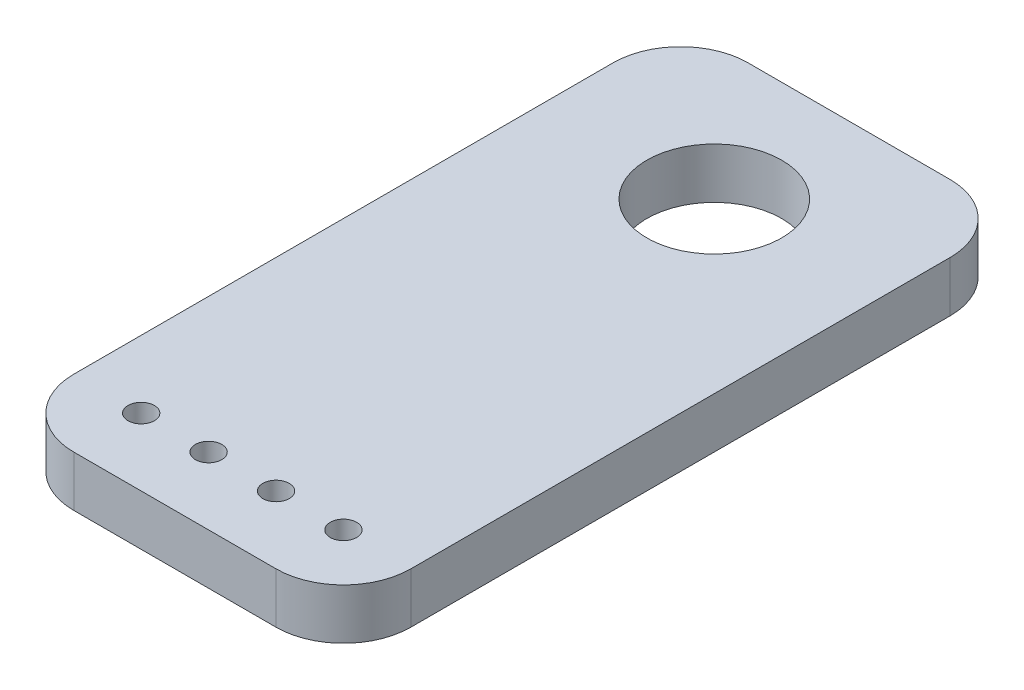
ISO-10303-21;
HEADER;
FILE_DESCRIPTION(('STEP AP214'),'2;1');
FILE_NAME('part.step','',(''),(''),'','','');
FILE_SCHEMA(('AUTOMOTIVE_DESIGN { 1 0 10303 214 1 1 1 1 }'));
ENDSEC;
DATA;
#1=APPLICATION_CONTEXT('core data for automotive mechanical design processes');
#2=APPLICATION_PROTOCOL_DEFINITION('international standard','automotive_design',2000,#1);
#3=PRODUCT_CONTEXT('',#1,'mechanical');
#4=PRODUCT('Part','Part','',(#3));
#5=PRODUCT_RELATED_PRODUCT_CATEGORY('part','',(#4));
#6=PRODUCT_DEFINITION_FORMATION('','',#4);
#7=PRODUCT_DEFINITION_CONTEXT('part definition',#1,'design');
#8=PRODUCT_DEFINITION('design','',#6,#7);
#9=PRODUCT_DEFINITION_SHAPE('','',#8);
#10=(LENGTH_UNIT() NAMED_UNIT(*) SI_UNIT(.MILLI.,.METRE.));
#11=(NAMED_UNIT(*) PLANE_ANGLE_UNIT() SI_UNIT($,.RADIAN.));
#12=(NAMED_UNIT(*) SI_UNIT($,.STERADIAN.) SOLID_ANGLE_UNIT());
#13=UNCERTAINTY_MEASURE_WITH_UNIT(LENGTH_MEASURE(1.E-05),#10,'distance_accuracy_value','');
#14=(GEOMETRIC_REPRESENTATION_CONTEXT(3) GLOBAL_UNCERTAINTY_ASSIGNED_CONTEXT((#13)) GLOBAL_UNIT_ASSIGNED_CONTEXT((#10,
#11,#12)) REPRESENTATION_CONTEXT('',''));
#15=CARTESIAN_POINT('',(0.,0.,0.));
#16=DIRECTION('',(0.,0.,1.));
#17=DIRECTION('',(1.,0.,0.));
#18=AXIS2_PLACEMENT_3D('',#15,#16,#17);
#19=CARTESIAN_POINT('',(0.,9.525,0.));
#20=DIRECTION('',(0.,1.,0.));
#21=DIRECTION('',(0.,0.,1.));
#22=AXIS2_PLACEMENT_3D('',#19,#20,#21);
#23=PLANE('',#22);
#24=CARTESIAN_POINT('',(38.1,9.525,114.3));
#25=DIRECTION('',(0.,1.,0.));
#26=DIRECTION('',(0.,0.,1.));
#27=AXIS2_PLACEMENT_3D('',#24,#25,#26);
#28=CIRCLE('',#27,2.4892);
#29=CARTESIAN_POINT('',(38.1,9.525,111.8108));
#30=VERTEX_POINT('',#29);
#31=EDGE_CURVE('E229',#30,#30,#28,.T.);
#32=ORIENTED_EDGE('',*,*,#31,.F.);
#33=EDGE_LOOP('',(#32));
#34=FACE_BOUND('',#33,.T.);
#35=CARTESIAN_POINT('',(12.7,9.525,114.3));
#36=DIRECTION('',(0.,1.,0.));
#37=DIRECTION('',(0.,0.,1.));
#38=AXIS2_PLACEMENT_3D('',#35,#36,#37);
#39=CIRCLE('',#38,2.48919999999999);
#40=CARTESIAN_POINT('',(12.7,9.525,111.8108));
#41=VERTEX_POINT('',#40);
#42=EDGE_CURVE('E244',#41,#41,#39,.T.);
#43=ORIENTED_EDGE('',*,*,#42,.F.);
#44=EDGE_LOOP('',(#43));
#45=FACE_BOUND('',#44,.T.);
#46=DIRECTION('',(0.,0.,1.));
#47=VECTOR('',#46,1.);
#48=CARTESIAN_POINT('',(0.,9.525,0.));
#49=LINE('',#48,#47);
#50=CARTESIAN_POINT('',(0.,9.525,12.7));
#51=VERTEX_POINT('',#50);
#52=CARTESIAN_POINT('',(0.,9.525,114.3));
#53=VERTEX_POINT('',#52);
#54=EDGE_CURVE('E149',#51,#53,#49,.T.);
#55=ORIENTED_EDGE('',*,*,#54,.T.);
#56=CARTESIAN_POINT('',(12.7,9.525,114.3));
#57=DIRECTION('',(0.,1.,0.));
#58=DIRECTION('',(0.,0.,1.));
#59=AXIS2_PLACEMENT_3D('',#56,#57,#58);
#60=CIRCLE('',#59,12.7);
#61=CARTESIAN_POINT('',(12.7,9.525,127.));
#62=VERTEX_POINT('',#61);
#63=EDGE_CURVE('E173',#53,#62,#60,.T.);
#64=ORIENTED_EDGE('',*,*,#63,.T.);
#65=DIRECTION('',(1.,0.,0.));
#66=VECTOR('',#65,1.);
#67=CARTESIAN_POINT('',(0.,9.525,127.));
#68=LINE('',#67,#66);
#69=CARTESIAN_POINT('',(50.8,9.525,127.));
#70=VERTEX_POINT('',#69);
#71=EDGE_CURVE('E126',#62,#70,#68,.T.);
#72=ORIENTED_EDGE('',*,*,#71,.T.);
#73=CARTESIAN_POINT('',(50.8,9.525,114.3));
#74=DIRECTION('',(0.,1.,0.));
#75=DIRECTION('',(0.,0.,1.));
#76=AXIS2_PLACEMENT_3D('',#73,#74,#75);
#77=CIRCLE('',#76,12.7);
#78=CARTESIAN_POINT('',(63.5,9.525,114.3));
#79=VERTEX_POINT('',#78);
#80=EDGE_CURVE('E170',#70,#79,#77,.T.);
#81=ORIENTED_EDGE('',*,*,#80,.T.);
#82=DIRECTION('',(0.,0.,-1.));
#83=VECTOR('',#82,1.);
#84=CARTESIAN_POINT('',(63.5,9.525,0.));
#85=LINE('',#84,#83);
#86=CARTESIAN_POINT('',(63.5,9.525,12.7));
#87=VERTEX_POINT('',#86);
#88=EDGE_CURVE('E199',#79,#87,#85,.T.);
#89=ORIENTED_EDGE('',*,*,#88,.T.);
#90=CARTESIAN_POINT('',(50.8,9.525,12.7));
#91=DIRECTION('',(0.,1.,0.));
#92=DIRECTION('',(0.,0.,1.));
#93=AXIS2_PLACEMENT_3D('',#90,#91,#92);
#94=CIRCLE('',#93,12.7);
#95=CARTESIAN_POINT('',(50.8,9.525,0.));
#96=VERTEX_POINT('',#95);
#97=EDGE_CURVE('E60',#87,#96,#94,.T.);
#98=ORIENTED_EDGE('',*,*,#97,.T.);
#99=DIRECTION('',(-1.,0.,0.));
#100=VECTOR('',#99,1.);
#101=CARTESIAN_POINT('',(0.,9.525,0.));
#102=LINE('',#101,#100);
#103=CARTESIAN_POINT('',(12.7,9.525,0.));
#104=VERTEX_POINT('',#103);
#105=EDGE_CURVE('E151',#96,#104,#102,.T.);
#106=ORIENTED_EDGE('',*,*,#105,.T.);
#107=CARTESIAN_POINT('',(12.7,9.525,12.7));
#108=DIRECTION('',(0.,1.,0.));
#109=DIRECTION('',(0.,0.,1.));
#110=AXIS2_PLACEMENT_3D('',#107,#108,#109);
#111=CIRCLE('',#110,12.7);
#112=EDGE_CURVE('E167',#104,#51,#111,.T.);
#113=ORIENTED_EDGE('',*,*,#112,.T.);
#114=EDGE_LOOP('',(#55,#64,#72,#81,#89,#98,#106,#113));
#115=FACE_BOUND('',#114,.T.);
#116=CARTESIAN_POINT('',(31.75,9.525,25.4));
#117=DIRECTION('',(0.,1.,0.));
#118=DIRECTION('',(0.,0.,1.));
#119=AXIS2_PLACEMENT_3D('',#116,#117,#118);
#120=CIRCLE('',#119,12.7);
#121=CARTESIAN_POINT('',(31.75,9.525,12.7));
#122=VERTEX_POINT('',#121);
#123=EDGE_CURVE('E143',#122,#122,#120,.T.);
#124=ORIENTED_EDGE('',*,*,#123,.F.);
#125=EDGE_LOOP('',(#124));
#126=FACE_BOUND('',#125,.T.);
#127=CARTESIAN_POINT('',(25.4,9.525,114.3));
#128=DIRECTION('',(0.,1.,0.));
#129=DIRECTION('',(0.,0.,1.));
#130=AXIS2_PLACEMENT_3D('',#127,#128,#129);
#131=CIRCLE('',#130,2.4892);
#132=CARTESIAN_POINT('',(25.4,9.525,111.8108));
#133=VERTEX_POINT('',#132);
#134=EDGE_CURVE('E217',#133,#133,#131,.T.);
#135=ORIENTED_EDGE('',*,*,#134,.F.);
#136=EDGE_LOOP('',(#135));
#137=FACE_BOUND('',#136,.T.);
#138=CARTESIAN_POINT('',(50.8,9.525,114.3));
#139=DIRECTION('',(0.,1.,0.));
#140=DIRECTION('',(0.,0.,1.));
#141=AXIS2_PLACEMENT_3D('',#138,#139,#140);
#142=CIRCLE('',#141,2.48919999999999);
#143=CARTESIAN_POINT('',(50.8,9.525,111.8108));
#144=VERTEX_POINT('',#143);
#145=EDGE_CURVE('E220',#144,#144,#142,.T.);
#146=ORIENTED_EDGE('',*,*,#145,.F.);
#147=EDGE_LOOP('',(#146));
#148=FACE_BOUND('',#147,.T.);
#149=ADVANCED_FACE('F39',(#34,#45,#115,#126,#137,#148),#23,.T.);
#150=CARTESIAN_POINT('',(0.,0.,0.));
#151=DIRECTION('',(0.,1.,0.));
#152=DIRECTION('',(0.,0.,1.));
#153=AXIS2_PLACEMENT_3D('',#150,#151,#152);
#154=PLANE('',#153);
#155=DIRECTION('',(1.,0.,0.));
#156=VECTOR('',#155,1.);
#157=CARTESIAN_POINT('',(0.,0.,127.));
#158=LINE('',#157,#156);
#159=CARTESIAN_POINT('',(12.7,0.,127.));
#160=VERTEX_POINT('',#159);
#161=CARTESIAN_POINT('',(50.8,0.,127.));
#162=VERTEX_POINT('',#161);
#163=EDGE_CURVE('E123',#160,#162,#158,.T.);
#164=ORIENTED_EDGE('',*,*,#163,.F.);
#165=CARTESIAN_POINT('',(12.7,0.,114.3));
#166=DIRECTION('',(0.,1.,0.));
#167=DIRECTION('',(0.,0.,1.));
#168=AXIS2_PLACEMENT_3D('',#165,#166,#167);
#169=CIRCLE('',#168,12.7);
#170=CARTESIAN_POINT('',(0.,0.,114.3));
#171=VERTEX_POINT('',#170);
#172=EDGE_CURVE('E105',#160,#171,#169,.F.);
#173=ORIENTED_EDGE('',*,*,#172,.T.);
#174=DIRECTION('',(0.,0.,1.));
#175=VECTOR('',#174,1.);
#176=CARTESIAN_POINT('',(0.,0.,0.));
#177=LINE('',#176,#175);
#178=CARTESIAN_POINT('',(0.,0.,12.7));
#179=VERTEX_POINT('',#178);
#180=EDGE_CURVE('E136',#179,#171,#177,.T.);
#181=ORIENTED_EDGE('',*,*,#180,.F.);
#182=CARTESIAN_POINT('',(12.7,0.,12.7));
#183=DIRECTION('',(0.,1.,0.));
#184=DIRECTION('',(0.,0.,1.));
#185=AXIS2_PLACEMENT_3D('',#182,#183,#184);
#186=CIRCLE('',#185,12.7);
#187=CARTESIAN_POINT('',(12.7,0.,0.));
#188=VERTEX_POINT('',#187);
#189=EDGE_CURVE('E155',#179,#188,#186,.F.);
#190=ORIENTED_EDGE('',*,*,#189,.T.);
#191=DIRECTION('',(-1.,0.,0.));
#192=VECTOR('',#191,1.);
#193=CARTESIAN_POINT('',(0.,0.,0.));
#194=LINE('',#193,#192);
#195=CARTESIAN_POINT('',(50.8,0.,0.));
#196=VERTEX_POINT('',#195);
#197=EDGE_CURVE('E141',#196,#188,#194,.T.);
#198=ORIENTED_EDGE('',*,*,#197,.F.);
#199=CARTESIAN_POINT('',(50.8,0.,12.7));
#200=DIRECTION('',(0.,1.,0.));
#201=DIRECTION('',(0.,0.,1.));
#202=AXIS2_PLACEMENT_3D('',#199,#200,#201);
#203=CIRCLE('',#202,12.7);
#204=CARTESIAN_POINT('',(63.5,0.,12.7));
#205=VERTEX_POINT('',#204);
#206=EDGE_CURVE('E128',#196,#205,#203,.F.);
#207=ORIENTED_EDGE('',*,*,#206,.T.);
#208=DIRECTION('',(0.,0.,-1.));
#209=VECTOR('',#208,1.);
#210=CARTESIAN_POINT('',(63.5,0.,0.));
#211=LINE('',#210,#209);
#212=CARTESIAN_POINT('',(63.5,0.,114.3));
#213=VERTEX_POINT('',#212);
#214=EDGE_CURVE('E135',#213,#205,#211,.T.);
#215=ORIENTED_EDGE('',*,*,#214,.F.);
#216=CARTESIAN_POINT('',(50.8,0.,114.3));
#217=DIRECTION('',(0.,1.,0.));
#218=DIRECTION('',(0.,0.,1.));
#219=AXIS2_PLACEMENT_3D('',#216,#217,#218);
#220=CIRCLE('',#219,12.7);
#221=EDGE_CURVE('E117',#213,#162,#220,.F.);
#222=ORIENTED_EDGE('',*,*,#221,.T.);
#223=EDGE_LOOP('',(#164,#173,#181,#190,#198,#207,#215,#222));
#224=FACE_BOUND('',#223,.T.);
#225=CARTESIAN_POINT('',(31.75,0.,25.4));
#226=DIRECTION('',(0.,1.,0.));
#227=DIRECTION('',(0.,0.,1.));
#228=AXIS2_PLACEMENT_3D('',#225,#226,#227);
#229=CIRCLE('',#228,12.7);
#230=CARTESIAN_POINT('',(31.75,0.,12.7));
#231=VERTEX_POINT('',#230);
#232=EDGE_CURVE('E202',#231,#231,#229,.T.);
#233=ORIENTED_EDGE('',*,*,#232,.T.);
#234=EDGE_LOOP('',(#233));
#235=FACE_BOUND('',#234,.T.);
#236=CARTESIAN_POINT('',(12.7,0.,114.3));
#237=DIRECTION('',(0.,1.,0.));
#238=DIRECTION('',(0.,0.,1.));
#239=AXIS2_PLACEMENT_3D('',#236,#237,#238);
#240=CIRCLE('',#239,2.48919999999999);
#241=CARTESIAN_POINT('',(12.7,0.,111.8108));
#242=VERTEX_POINT('',#241);
#243=EDGE_CURVE('E240',#242,#242,#240,.T.);
#244=ORIENTED_EDGE('',*,*,#243,.T.);
#245=EDGE_LOOP('',(#244));
#246=FACE_BOUND('',#245,.T.);
#247=CARTESIAN_POINT('',(25.4,0.,114.3));
#248=DIRECTION('',(0.,1.,0.));
#249=DIRECTION('',(0.,0.,1.));
#250=AXIS2_PLACEMENT_3D('',#247,#248,#249);
#251=CIRCLE('',#250,2.4892);
#252=CARTESIAN_POINT('',(25.4,0.,111.8108));
#253=VERTEX_POINT('',#252);
#254=EDGE_CURVE('E236',#253,#253,#251,.T.);
#255=ORIENTED_EDGE('',*,*,#254,.T.);
#256=EDGE_LOOP('',(#255));
#257=FACE_BOUND('',#256,.T.);
#258=CARTESIAN_POINT('',(38.1,0.,114.3));
#259=DIRECTION('',(0.,1.,0.));
#260=DIRECTION('',(0.,0.,1.));
#261=AXIS2_PLACEMENT_3D('',#258,#259,#260);
#262=CIRCLE('',#261,2.4892);
#263=CARTESIAN_POINT('',(38.1,0.,111.8108));
#264=VERTEX_POINT('',#263);
#265=EDGE_CURVE('E223',#264,#264,#262,.T.);
#266=ORIENTED_EDGE('',*,*,#265,.T.);
#267=EDGE_LOOP('',(#266));
#268=FACE_BOUND('',#267,.T.);
#269=CARTESIAN_POINT('',(50.8,0.,114.3));
#270=DIRECTION('',(0.,1.,0.));
#271=DIRECTION('',(0.,0.,1.));
#272=AXIS2_PLACEMENT_3D('',#269,#270,#271);
#273=CIRCLE('',#272,2.48919999999999);
#274=CARTESIAN_POINT('',(50.8,0.,111.8108));
#275=VERTEX_POINT('',#274);
#276=EDGE_CURVE('E224',#275,#275,#273,.T.);
#277=ORIENTED_EDGE('',*,*,#276,.T.);
#278=EDGE_LOOP('',(#277));
#279=FACE_BOUND('',#278,.T.);
#280=ADVANCED_FACE('F131',(#224,#235,#246,#257,#268,#279),#154,.F.);
#281=CARTESIAN_POINT('',(0.,9.525,0.));
#282=DIRECTION('',(1.,0.,0.));
#283=DIRECTION('',(0.,0.,-1.));
#284=AXIS2_PLACEMENT_3D('',#281,#282,#283);
#285=PLANE('',#284);
#286=ORIENTED_EDGE('',*,*,#180,.T.);
#287=DIRECTION('',(0.,-1.,0.));
#288=VECTOR('',#287,1.);
#289=CARTESIAN_POINT('',(0.,9.525,114.3));
#290=LINE('',#289,#288);
#291=EDGE_CURVE('E110',#171,#53,#290,.F.);
#292=ORIENTED_EDGE('',*,*,#291,.T.);
#293=ORIENTED_EDGE('',*,*,#54,.F.);
#294=DIRECTION('',(0.,-1.,0.));
#295=VECTOR('',#294,1.);
#296=CARTESIAN_POINT('',(0.,9.525,12.7));
#297=LINE('',#296,#295);
#298=EDGE_CURVE('E116',#51,#179,#297,.T.);
#299=ORIENTED_EDGE('',*,*,#298,.T.);
#300=EDGE_LOOP('',(#286,#292,#293,#299));
#301=FACE_BOUND('',#300,.T.);
#302=ADVANCED_FACE('F194',(#301),#285,.F.);
#303=CARTESIAN_POINT('',(0.,9.525,127.));
#304=DIRECTION('',(0.,0.,-1.));
#305=DIRECTION('',(-1.,0.,0.));
#306=AXIS2_PLACEMENT_3D('',#303,#304,#305);
#307=PLANE('',#306);
#308=ORIENTED_EDGE('',*,*,#71,.F.);
#309=DIRECTION('',(0.,-1.,0.));
#310=VECTOR('',#309,1.);
#311=CARTESIAN_POINT('',(12.7,9.525,127.));
#312=LINE('',#311,#310);
#313=EDGE_CURVE('E109',#62,#160,#312,.T.);
#314=ORIENTED_EDGE('',*,*,#313,.T.);
#315=ORIENTED_EDGE('',*,*,#163,.T.);
#316=DIRECTION('',(0.,-1.,0.));
#317=VECTOR('',#316,1.);
#318=CARTESIAN_POINT('',(50.8,9.525,127.));
#319=LINE('',#318,#317);
#320=EDGE_CURVE('E129',#162,#70,#319,.F.);
#321=ORIENTED_EDGE('',*,*,#320,.T.);
#322=EDGE_LOOP('',(#308,#314,#315,#321));
#323=FACE_BOUND('',#322,.T.);
#324=ADVANCED_FACE('F122',(#323),#307,.F.);
#325=CARTESIAN_POINT('',(63.5,9.525,0.));
#326=DIRECTION('',(-1.,0.,0.));
#327=DIRECTION('',(0.,0.,1.));
#328=AXIS2_PLACEMENT_3D('',#325,#326,#327);
#329=PLANE('',#328);
#330=ORIENTED_EDGE('',*,*,#88,.F.);
#331=DIRECTION('',(0.,-1.,0.));
#332=VECTOR('',#331,1.);
#333=CARTESIAN_POINT('',(63.5,9.525,114.3));
#334=LINE('',#333,#332);
#335=EDGE_CURVE('E179',#79,#213,#334,.T.);
#336=ORIENTED_EDGE('',*,*,#335,.T.);
#337=ORIENTED_EDGE('',*,*,#214,.T.);
#338=DIRECTION('',(0.,-1.,0.));
#339=VECTOR('',#338,1.);
#340=CARTESIAN_POINT('',(63.5,9.525,12.7));
#341=LINE('',#340,#339);
#342=EDGE_CURVE('E176',#205,#87,#341,.F.);
#343=ORIENTED_EDGE('',*,*,#342,.T.);
#344=EDGE_LOOP('',(#330,#336,#337,#343));
#345=FACE_BOUND('',#344,.T.);
#346=ADVANCED_FACE('F268',(#345),#329,.F.);
#347=CARTESIAN_POINT('',(0.,9.525,0.));
#348=DIRECTION('',(0.,0.,1.));
#349=DIRECTION('',(1.,0.,0.));
#350=AXIS2_PLACEMENT_3D('',#347,#348,#349);
#351=PLANE('',#350);
#352=ORIENTED_EDGE('',*,*,#197,.T.);
#353=DIRECTION('',(0.,-1.,0.));
#354=VECTOR('',#353,1.);
#355=CARTESIAN_POINT('',(12.7,9.525,0.));
#356=LINE('',#355,#354);
#357=EDGE_CURVE('E11',#188,#104,#356,.F.);
#358=ORIENTED_EDGE('',*,*,#357,.T.);
#359=ORIENTED_EDGE('',*,*,#105,.F.);
#360=DIRECTION('',(0.,-1.,0.));
#361=VECTOR('',#360,1.);
#362=CARTESIAN_POINT('',(50.8,9.525,0.));
#363=LINE('',#362,#361);
#364=EDGE_CURVE('E48',#96,#196,#363,.T.);
#365=ORIENTED_EDGE('',*,*,#364,.T.);
#366=EDGE_LOOP('',(#352,#358,#359,#365));
#367=FACE_BOUND('',#366,.T.);
#368=ADVANCED_FACE('F186',(#367),#351,.F.);
#369=CARTESIAN_POINT('',(31.75,9.525,25.4));
#370=DIRECTION('',(0.,-1.,0.));
#371=DIRECTION('',(0.,0.,-1.));
#372=AXIS2_PLACEMENT_3D('',#369,#370,#371);
#373=CYLINDRICAL_SURFACE('',#372,12.7);
#374=CARTESIAN_POINT('',(31.75,9.525,12.7));
#375=CARTESIAN_POINT('',(31.75,9.42578125,12.7));
#376=CARTESIAN_POINT('',(31.75,9.3265625,12.7));
#377=CARTESIAN_POINT('',(31.75,9.128125,12.7));
#378=CARTESIAN_POINT('',(31.75,9.02890625,12.7));
#379=CARTESIAN_POINT('',(31.75,8.83046875,12.7));
#380=CARTESIAN_POINT('',(31.75,8.73125,12.7));
#381=CARTESIAN_POINT('',(31.75,8.5328125,12.7));
#382=CARTESIAN_POINT('',(31.75,8.43359375,12.7));
#383=CARTESIAN_POINT('',(31.75,8.23515625,12.7));
#384=CARTESIAN_POINT('',(31.75,8.1359375,12.7));
#385=CARTESIAN_POINT('',(31.75,7.9375,12.7));
#386=CARTESIAN_POINT('',(31.75,7.83828125,12.7));
#387=CARTESIAN_POINT('',(31.75,7.63984375,12.7));
#388=CARTESIAN_POINT('',(31.75,7.540625,12.7));
#389=CARTESIAN_POINT('',(31.75,7.3421875,12.7));
#390=CARTESIAN_POINT('',(31.75,7.24296875,12.7));
#391=CARTESIAN_POINT('',(31.75,7.04453125,12.7));
#392=CARTESIAN_POINT('',(31.75,6.9453125,12.7));
#393=CARTESIAN_POINT('',(31.75,6.746875,12.7));
#394=CARTESIAN_POINT('',(31.75,6.64765625,12.7));
#395=CARTESIAN_POINT('',(31.75,6.44921875,12.7));
#396=CARTESIAN_POINT('',(31.75,6.35,12.7));
#397=CARTESIAN_POINT('',(31.75,6.1515625,12.7));
#398=CARTESIAN_POINT('',(31.75,6.05234375,12.7));
#399=CARTESIAN_POINT('',(31.75,5.85390625,12.7));
#400=CARTESIAN_POINT('',(31.75,5.7546875,12.7));
#401=CARTESIAN_POINT('',(31.75,5.55625,12.7));
#402=CARTESIAN_POINT('',(31.75,5.45703125,12.7));
#403=CARTESIAN_POINT('',(31.75,5.25859375,12.7));
#404=CARTESIAN_POINT('',(31.75,5.159375,12.7));
#405=CARTESIAN_POINT('',(31.75,4.9609375,12.7));
#406=CARTESIAN_POINT('',(31.75,4.86171875,12.7));
#407=CARTESIAN_POINT('',(31.75,4.66328125,12.7));
#408=CARTESIAN_POINT('',(31.75,4.5640625,12.7));
#409=CARTESIAN_POINT('',(31.75,4.365625,12.7));
#410=CARTESIAN_POINT('',(31.75,4.26640625,12.7));
#411=CARTESIAN_POINT('',(31.75,4.06796875,12.7));
#412=CARTESIAN_POINT('',(31.75,3.96875,12.7));
#413=CARTESIAN_POINT('',(31.75,3.7703125,12.7));
#414=CARTESIAN_POINT('',(31.75,3.67109375,12.7));
#415=CARTESIAN_POINT('',(31.75,3.47265625,12.7));
#416=CARTESIAN_POINT('',(31.75,3.3734375,12.7));
#417=CARTESIAN_POINT('',(31.75,3.175,12.7));
#418=CARTESIAN_POINT('',(31.75,3.07578125,12.7));
#419=CARTESIAN_POINT('',(31.75,2.87734375,12.7));
#420=CARTESIAN_POINT('',(31.75,2.778125,12.7));
#421=CARTESIAN_POINT('',(31.75,2.5796875,12.7));
#422=CARTESIAN_POINT('',(31.75,2.48046875,12.7));
#423=CARTESIAN_POINT('',(31.75,2.28203125,12.7));
#424=CARTESIAN_POINT('',(31.75,2.1828125,12.7));
#425=CARTESIAN_POINT('',(31.75,1.984375,12.7));
#426=CARTESIAN_POINT('',(31.75,1.88515625,12.7));
#427=CARTESIAN_POINT('',(31.75,1.68671875,12.7));
#428=CARTESIAN_POINT('',(31.75,1.5875,12.7));
#429=CARTESIAN_POINT('',(31.75,1.3890625,12.7));
#430=CARTESIAN_POINT('',(31.75,1.28984375,12.7));
#431=CARTESIAN_POINT('',(31.75,1.09140625,12.7));
#432=CARTESIAN_POINT('',(31.75,0.992187500000001,12.7));
#433=CARTESIAN_POINT('',(31.75,0.793750000000001,12.7));
#434=CARTESIAN_POINT('',(31.75,0.69453125,12.7));
#435=CARTESIAN_POINT('',(31.75,0.49609375,12.7));
#436=CARTESIAN_POINT('',(31.75,0.396875,12.7));
#437=CARTESIAN_POINT('',(31.75,0.1984375,12.7));
#438=CARTESIAN_POINT('',(31.75,0.0992187500000001,12.7));
#439=CARTESIAN_POINT('',(31.75,0.,12.7));
#440=B_SPLINE_CURVE_WITH_KNOTS('',3,(#374,#375,#376,#377,#378,#379,#380,#381,#382,#383,#384,
#385,#386,#387,#388,#389,#390,#391,#392,#393,#394,#395,#396,#397,#398,#399,#400,#401,#402,#403,
#404,#405,#406,#407,#408,#409,#410,#411,#412,#413,#414,#415,#416,#417,#418,#419,#420,#421,#422,
#423,#424,#425,#426,#427,#428,#429,#430,#431,#432,#433,#434,#435,#436,#437,#438,#439),
.UNSPECIFIED.,.F.,.F.,(4,2,2,2,2,2,2,2,2,2,2,2,2,2,2,2,2,2,2,2,2,2,2,2,2,2,2,2,2,2,2,2,4),(0.,
0.29765625,0.5953125,0.892968750000001,1.190625,1.48828125,1.7859375,2.08359375,2.38125,
2.67890625,2.9765625,3.27421875,3.571875,3.86953125,4.1671875,4.46484375,4.7625,5.06015625,
5.3578125,5.65546875,5.953125,6.25078125,6.5484375,6.84609375,7.14375,7.44140625,7.7390625,
8.03671875,8.334375,8.63203125,8.9296875,9.22734375,9.525),.UNSPECIFIED.);
#441=EDGE_CURVE('BSEAM257',#122,#231,#440,.T.);
#442=ORIENTED_EDGE('',*,*,#123,.T.);
#443=ORIENTED_EDGE('',*,*,#232,.F.);
#444=ORIENTED_EDGE('',*,*,#441,.T.);
#445=ORIENTED_EDGE('',*,*,#441,.F.);
#446=EDGE_LOOP('',(#442,#444,#443,#445));
#447=FACE_BOUND('',#446,.T.);
#448=ADVANCED_FACE('F257',(#447),#373,.F.);
#449=CARTESIAN_POINT('',(12.7,9.525,114.3));
#450=DIRECTION('',(0.,-1.,0.));
#451=DIRECTION('',(0.,0.,-1.));
#452=AXIS2_PLACEMENT_3D('',#449,#450,#451);
#453=CYLINDRICAL_SURFACE('',#452,2.48919999999999);
#454=CARTESIAN_POINT('',(12.7,9.525,111.8108));
#455=CARTESIAN_POINT('',(12.7,9.42578125,111.8108));
#456=CARTESIAN_POINT('',(12.7,9.3265625,111.8108));
#457=CARTESIAN_POINT('',(12.7,9.128125,111.8108));
#458=CARTESIAN_POINT('',(12.7,9.02890625,111.8108));
#459=CARTESIAN_POINT('',(12.7,8.83046875,111.8108));
#460=CARTESIAN_POINT('',(12.7,8.73125,111.8108));
#461=CARTESIAN_POINT('',(12.7,8.5328125,111.8108));
#462=CARTESIAN_POINT('',(12.7,8.43359375,111.8108));
#463=CARTESIAN_POINT('',(12.7,8.23515625,111.8108));
#464=CARTESIAN_POINT('',(12.7,8.1359375,111.8108));
#465=CARTESIAN_POINT('',(12.7,7.9375,111.8108));
#466=CARTESIAN_POINT('',(12.7,7.83828125,111.8108));
#467=CARTESIAN_POINT('',(12.7,7.63984375,111.8108));
#468=CARTESIAN_POINT('',(12.7,7.540625,111.8108));
#469=CARTESIAN_POINT('',(12.7,7.3421875,111.8108));
#470=CARTESIAN_POINT('',(12.7,7.24296875,111.8108));
#471=CARTESIAN_POINT('',(12.7,7.04453125,111.8108));
#472=CARTESIAN_POINT('',(12.7,6.9453125,111.8108));
#473=CARTESIAN_POINT('',(12.7,6.746875,111.8108));
#474=CARTESIAN_POINT('',(12.7,6.64765625,111.8108));
#475=CARTESIAN_POINT('',(12.7,6.44921875,111.8108));
#476=CARTESIAN_POINT('',(12.7,6.35,111.8108));
#477=CARTESIAN_POINT('',(12.7,6.1515625,111.8108));
#478=CARTESIAN_POINT('',(12.7,6.05234375,111.8108));
#479=CARTESIAN_POINT('',(12.7,5.85390625,111.8108));
#480=CARTESIAN_POINT('',(12.7,5.7546875,111.8108));
#481=CARTESIAN_POINT('',(12.7,5.55625,111.8108));
#482=CARTESIAN_POINT('',(12.7,5.45703125,111.8108));
#483=CARTESIAN_POINT('',(12.7,5.25859375,111.8108));
#484=CARTESIAN_POINT('',(12.7,5.159375,111.8108));
#485=CARTESIAN_POINT('',(12.7,4.9609375,111.8108));
#486=CARTESIAN_POINT('',(12.7,4.86171875,111.8108));
#487=CARTESIAN_POINT('',(12.7,4.66328125,111.8108));
#488=CARTESIAN_POINT('',(12.7,4.5640625,111.8108));
#489=CARTESIAN_POINT('',(12.7,4.365625,111.8108));
#490=CARTESIAN_POINT('',(12.7,4.26640625,111.8108));
#491=CARTESIAN_POINT('',(12.7,4.06796875,111.8108));
#492=CARTESIAN_POINT('',(12.7,3.96875,111.8108));
#493=CARTESIAN_POINT('',(12.7,3.7703125,111.8108));
#494=CARTESIAN_POINT('',(12.7,3.67109375,111.8108));
#495=CARTESIAN_POINT('',(12.7,3.47265625,111.8108));
#496=CARTESIAN_POINT('',(12.7,3.3734375,111.8108));
#497=CARTESIAN_POINT('',(12.7,3.175,111.8108));
#498=CARTESIAN_POINT('',(12.7,3.07578125,111.8108));
#499=CARTESIAN_POINT('',(12.7,2.87734375,111.8108));
#500=CARTESIAN_POINT('',(12.7,2.778125,111.8108));
#501=CARTESIAN_POINT('',(12.7,2.5796875,111.8108));
#502=CARTESIAN_POINT('',(12.7,2.48046875,111.8108));
#503=CARTESIAN_POINT('',(12.7,2.28203125,111.8108));
#504=CARTESIAN_POINT('',(12.7,2.1828125,111.8108));
#505=CARTESIAN_POINT('',(12.7,1.984375,111.8108));
#506=CARTESIAN_POINT('',(12.7,1.88515625,111.8108));
#507=CARTESIAN_POINT('',(12.7,1.68671875,111.8108));
#508=CARTESIAN_POINT('',(12.7,1.5875,111.8108));
#509=CARTESIAN_POINT('',(12.7,1.3890625,111.8108));
#510=CARTESIAN_POINT('',(12.7,1.28984375,111.8108));
#511=CARTESIAN_POINT('',(12.7,1.09140625,111.8108));
#512=CARTESIAN_POINT('',(12.7,0.992187500000001,111.8108));
#513=CARTESIAN_POINT('',(12.7,0.793750000000001,111.8108));
#514=CARTESIAN_POINT('',(12.7,0.69453125,111.8108));
#515=CARTESIAN_POINT('',(12.7,0.49609375,111.8108));
#516=CARTESIAN_POINT('',(12.7,0.396875,111.8108));
#517=CARTESIAN_POINT('',(12.7,0.1984375,111.8108));
#518=CARTESIAN_POINT('',(12.7,0.0992187500000001,111.8108));
#519=CARTESIAN_POINT('',(12.7,0.,111.8108));
#520=B_SPLINE_CURVE_WITH_KNOTS('',3,(#454,#455,#456,#457,#458,#459,#460,#461,#462,#463,#464,
#465,#466,#467,#468,#469,#470,#471,#472,#473,#474,#475,#476,#477,#478,#479,#480,#481,#482,#483,
#484,#485,#486,#487,#488,#489,#490,#491,#492,#493,#494,#495,#496,#497,#498,#499,#500,#501,#502,
#503,#504,#505,#506,#507,#508,#509,#510,#511,#512,#513,#514,#515,#516,#517,#518,#519),
.UNSPECIFIED.,.F.,.F.,(4,2,2,2,2,2,2,2,2,2,2,2,2,2,2,2,2,2,2,2,2,2,2,2,2,2,2,2,2,2,2,2,4),(0.,
0.297656249999998,0.595312499999999,0.892968749999999,1.190625,1.48828125,1.7859375,2.08359375,
2.38125,2.67890625,2.9765625,3.27421875,3.571875,3.86953125,4.1671875,4.46484375,4.7625,
5.06015625,5.3578125,5.65546875,5.953125,6.25078125,6.5484375,6.84609375,7.14375,7.44140625,
7.7390625,8.03671875,8.334375,8.63203125,8.9296875,9.22734375,9.525),.UNSPECIFIED.);
#521=EDGE_CURVE('BSEAM259',#41,#242,#520,.T.);
#522=ORIENTED_EDGE('',*,*,#42,.T.);
#523=ORIENTED_EDGE('',*,*,#243,.F.);
#524=ORIENTED_EDGE('',*,*,#521,.T.);
#525=ORIENTED_EDGE('',*,*,#521,.F.);
#526=EDGE_LOOP('',(#522,#524,#523,#525));
#527=FACE_BOUND('',#526,.T.);
#528=ADVANCED_FACE('F259',(#527),#453,.F.);
#529=CARTESIAN_POINT('',(25.4,9.525,114.3));
#530=DIRECTION('',(0.,-1.,0.));
#531=DIRECTION('',(0.,0.,-1.));
#532=AXIS2_PLACEMENT_3D('',#529,#530,#531);
#533=CYLINDRICAL_SURFACE('',#532,2.4892);
#534=CARTESIAN_POINT('',(25.4,9.525,111.8108));
#535=CARTESIAN_POINT('',(25.4,9.42578125,111.8108));
#536=CARTESIAN_POINT('',(25.4,9.3265625,111.8108));
#537=CARTESIAN_POINT('',(25.4,9.128125,111.8108));
#538=CARTESIAN_POINT('',(25.4,9.02890625,111.8108));
#539=CARTESIAN_POINT('',(25.4,8.83046875,111.8108));
#540=CARTESIAN_POINT('',(25.4,8.73125,111.8108));
#541=CARTESIAN_POINT('',(25.4,8.5328125,111.8108));
#542=CARTESIAN_POINT('',(25.4,8.43359375,111.8108));
#543=CARTESIAN_POINT('',(25.4,8.23515625,111.8108));
#544=CARTESIAN_POINT('',(25.4,8.1359375,111.8108));
#545=CARTESIAN_POINT('',(25.4,7.9375,111.8108));
#546=CARTESIAN_POINT('',(25.4,7.83828125,111.8108));
#547=CARTESIAN_POINT('',(25.4,7.63984375,111.8108));
#548=CARTESIAN_POINT('',(25.4,7.540625,111.8108));
#549=CARTESIAN_POINT('',(25.4,7.3421875,111.8108));
#550=CARTESIAN_POINT('',(25.4,7.24296875,111.8108));
#551=CARTESIAN_POINT('',(25.4,7.04453125,111.8108));
#552=CARTESIAN_POINT('',(25.4,6.9453125,111.8108));
#553=CARTESIAN_POINT('',(25.4,6.746875,111.8108));
#554=CARTESIAN_POINT('',(25.4,6.64765625,111.8108));
#555=CARTESIAN_POINT('',(25.4,6.44921875,111.8108));
#556=CARTESIAN_POINT('',(25.4,6.35,111.8108));
#557=CARTESIAN_POINT('',(25.4,6.1515625,111.8108));
#558=CARTESIAN_POINT('',(25.4,6.05234375,111.8108));
#559=CARTESIAN_POINT('',(25.4,5.85390625,111.8108));
#560=CARTESIAN_POINT('',(25.4,5.7546875,111.8108));
#561=CARTESIAN_POINT('',(25.4,5.55625,111.8108));
#562=CARTESIAN_POINT('',(25.4,5.45703125,111.8108));
#563=CARTESIAN_POINT('',(25.4,5.25859375,111.8108));
#564=CARTESIAN_POINT('',(25.4,5.159375,111.8108));
#565=CARTESIAN_POINT('',(25.4,4.9609375,111.8108));
#566=CARTESIAN_POINT('',(25.4,4.86171875,111.8108));
#567=CARTESIAN_POINT('',(25.4,4.66328125,111.8108));
#568=CARTESIAN_POINT('',(25.4,4.5640625,111.8108));
#569=CARTESIAN_POINT('',(25.4,4.365625,111.8108));
#570=CARTESIAN_POINT('',(25.4,4.26640625,111.8108));
#571=CARTESIAN_POINT('',(25.4,4.06796875,111.8108));
#572=CARTESIAN_POINT('',(25.4,3.96875,111.8108));
#573=CARTESIAN_POINT('',(25.4,3.7703125,111.8108));
#574=CARTESIAN_POINT('',(25.4,3.67109375,111.8108));
#575=CARTESIAN_POINT('',(25.4,3.47265625,111.8108));
#576=CARTESIAN_POINT('',(25.4,3.3734375,111.8108));
#577=CARTESIAN_POINT('',(25.4,3.175,111.8108));
#578=CARTESIAN_POINT('',(25.4,3.07578125,111.8108));
#579=CARTESIAN_POINT('',(25.4,2.87734375,111.8108));
#580=CARTESIAN_POINT('',(25.4,2.778125,111.8108));
#581=CARTESIAN_POINT('',(25.4,2.5796875,111.8108));
#582=CARTESIAN_POINT('',(25.4,2.48046875,111.8108));
#583=CARTESIAN_POINT('',(25.4,2.28203125,111.8108));
#584=CARTESIAN_POINT('',(25.4,2.1828125,111.8108));
#585=CARTESIAN_POINT('',(25.4,1.984375,111.8108));
#586=CARTESIAN_POINT('',(25.4,1.88515625,111.8108));
#587=CARTESIAN_POINT('',(25.4,1.68671875,111.8108));
#588=CARTESIAN_POINT('',(25.4,1.5875,111.8108));
#589=CARTESIAN_POINT('',(25.4,1.3890625,111.8108));
#590=CARTESIAN_POINT('',(25.4,1.28984375,111.8108));
#591=CARTESIAN_POINT('',(25.4,1.09140625,111.8108));
#592=CARTESIAN_POINT('',(25.4,0.992187500000001,111.8108));
#593=CARTESIAN_POINT('',(25.4,0.793750000000001,111.8108));
#594=CARTESIAN_POINT('',(25.4,0.69453125,111.8108));
#595=CARTESIAN_POINT('',(25.4,0.49609375,111.8108));
#596=CARTESIAN_POINT('',(25.4,0.396875,111.8108));
#597=CARTESIAN_POINT('',(25.4,0.1984375,111.8108));
#598=CARTESIAN_POINT('',(25.4,0.0992187500000001,111.8108));
#599=CARTESIAN_POINT('',(25.4,0.,111.8108));
#600=B_SPLINE_CURVE_WITH_KNOTS('',3,(#534,#535,#536,#537,#538,#539,#540,#541,#542,#543,#544,
#545,#546,#547,#548,#549,#550,#551,#552,#553,#554,#555,#556,#557,#558,#559,#560,#561,#562,#563,
#564,#565,#566,#567,#568,#569,#570,#571,#572,#573,#574,#575,#576,#577,#578,#579,#580,#581,#582,
#583,#584,#585,#586,#587,#588,#589,#590,#591,#592,#593,#594,#595,#596,#597,#598,#599),
.UNSPECIFIED.,.F.,.F.,(4,2,2,2,2,2,2,2,2,2,2,2,2,2,2,2,2,2,2,2,2,2,2,2,2,2,2,2,2,2,2,2,4),(0.,
0.297656249999998,0.595312499999999,0.892968749999999,1.190625,1.48828125,1.7859375,2.08359375,
2.38125,2.67890625,2.9765625,3.27421875,3.571875,3.86953125,4.1671875,4.46484375,4.7625,
5.06015625,5.3578125,5.65546875,5.953125,6.25078125,6.5484375,6.84609375,7.14375,7.44140625,
7.7390625,8.03671875,8.334375,8.63203125,8.9296875,9.22734375,9.525),.UNSPECIFIED.);
#601=EDGE_CURVE('BSEAM265',#133,#253,#600,.T.);
#602=ORIENTED_EDGE('',*,*,#134,.T.);
#603=ORIENTED_EDGE('',*,*,#254,.F.);
#604=ORIENTED_EDGE('',*,*,#601,.T.);
#605=ORIENTED_EDGE('',*,*,#601,.F.);
#606=EDGE_LOOP('',(#602,#604,#603,#605));
#607=FACE_BOUND('',#606,.T.);
#608=ADVANCED_FACE('F265',(#607),#533,.F.);
#609=CARTESIAN_POINT('',(38.1,9.525,114.3));
#610=DIRECTION('',(0.,-1.,0.));
#611=DIRECTION('',(0.,0.,-1.));
#612=AXIS2_PLACEMENT_3D('',#609,#610,#611);
#613=CYLINDRICAL_SURFACE('',#612,2.4892);
#614=CARTESIAN_POINT('',(38.1,9.525,111.8108));
#615=CARTESIAN_POINT('',(38.1,9.42578125,111.8108));
#616=CARTESIAN_POINT('',(38.1,9.3265625,111.8108));
#617=CARTESIAN_POINT('',(38.1,9.128125,111.8108));
#618=CARTESIAN_POINT('',(38.1,9.02890625,111.8108));
#619=CARTESIAN_POINT('',(38.1,8.83046875,111.8108));
#620=CARTESIAN_POINT('',(38.1,8.73125,111.8108));
#621=CARTESIAN_POINT('',(38.1,8.5328125,111.8108));
#622=CARTESIAN_POINT('',(38.1,8.43359375,111.8108));
#623=CARTESIAN_POINT('',(38.1,8.23515625,111.8108));
#624=CARTESIAN_POINT('',(38.1,8.1359375,111.8108));
#625=CARTESIAN_POINT('',(38.1,7.9375,111.8108));
#626=CARTESIAN_POINT('',(38.1,7.83828125,111.8108));
#627=CARTESIAN_POINT('',(38.1,7.63984375,111.8108));
#628=CARTESIAN_POINT('',(38.1,7.540625,111.8108));
#629=CARTESIAN_POINT('',(38.1,7.3421875,111.8108));
#630=CARTESIAN_POINT('',(38.1,7.24296875,111.8108));
#631=CARTESIAN_POINT('',(38.1,7.04453125,111.8108));
#632=CARTESIAN_POINT('',(38.1,6.9453125,111.8108));
#633=CARTESIAN_POINT('',(38.1,6.746875,111.8108));
#634=CARTESIAN_POINT('',(38.1,6.64765625,111.8108));
#635=CARTESIAN_POINT('',(38.1,6.44921875,111.8108));
#636=CARTESIAN_POINT('',(38.1,6.35,111.8108));
#637=CARTESIAN_POINT('',(38.1,6.1515625,111.8108));
#638=CARTESIAN_POINT('',(38.1,6.05234375,111.8108));
#639=CARTESIAN_POINT('',(38.1,5.85390625,111.8108));
#640=CARTESIAN_POINT('',(38.1,5.7546875,111.8108));
#641=CARTESIAN_POINT('',(38.1,5.55625,111.8108));
#642=CARTESIAN_POINT('',(38.1,5.45703125,111.8108));
#643=CARTESIAN_POINT('',(38.1,5.25859375,111.8108));
#644=CARTESIAN_POINT('',(38.1,5.159375,111.8108));
#645=CARTESIAN_POINT('',(38.1,4.9609375,111.8108));
#646=CARTESIAN_POINT('',(38.1,4.86171875,111.8108));
#647=CARTESIAN_POINT('',(38.1,4.66328125,111.8108));
#648=CARTESIAN_POINT('',(38.1,4.5640625,111.8108));
#649=CARTESIAN_POINT('',(38.1,4.365625,111.8108));
#650=CARTESIAN_POINT('',(38.1,4.26640625,111.8108));
#651=CARTESIAN_POINT('',(38.1,4.06796875,111.8108));
#652=CARTESIAN_POINT('',(38.1,3.96875,111.8108));
#653=CARTESIAN_POINT('',(38.1,3.7703125,111.8108));
#654=CARTESIAN_POINT('',(38.1,3.67109375,111.8108));
#655=CARTESIAN_POINT('',(38.1,3.47265625,111.8108));
#656=CARTESIAN_POINT('',(38.1,3.3734375,111.8108));
#657=CARTESIAN_POINT('',(38.1,3.175,111.8108));
#658=CARTESIAN_POINT('',(38.1,3.07578125,111.8108));
#659=CARTESIAN_POINT('',(38.1,2.87734375,111.8108));
#660=CARTESIAN_POINT('',(38.1,2.778125,111.8108));
#661=CARTESIAN_POINT('',(38.1,2.5796875,111.8108));
#662=CARTESIAN_POINT('',(38.1,2.48046875,111.8108));
#663=CARTESIAN_POINT('',(38.1,2.28203125,111.8108));
#664=CARTESIAN_POINT('',(38.1,2.1828125,111.8108));
#665=CARTESIAN_POINT('',(38.1,1.984375,111.8108));
#666=CARTESIAN_POINT('',(38.1,1.88515625,111.8108));
#667=CARTESIAN_POINT('',(38.1,1.68671875,111.8108));
#668=CARTESIAN_POINT('',(38.1,1.5875,111.8108));
#669=CARTESIAN_POINT('',(38.1,1.3890625,111.8108));
#670=CARTESIAN_POINT('',(38.1,1.28984375,111.8108));
#671=CARTESIAN_POINT('',(38.1,1.09140625,111.8108));
#672=CARTESIAN_POINT('',(38.1,0.992187500000001,111.8108));
#673=CARTESIAN_POINT('',(38.1,0.793750000000001,111.8108));
#674=CARTESIAN_POINT('',(38.1,0.69453125,111.8108));
#675=CARTESIAN_POINT('',(38.1,0.49609375,111.8108));
#676=CARTESIAN_POINT('',(38.1,0.396875,111.8108));
#677=CARTESIAN_POINT('',(38.1,0.1984375,111.8108));
#678=CARTESIAN_POINT('',(38.1,0.0992187500000001,111.8108));
#679=CARTESIAN_POINT('',(38.1,0.,111.8108));
#680=B_SPLINE_CURVE_WITH_KNOTS('',3,(#614,#615,#616,#617,#618,#619,#620,#621,#622,#623,#624,
#625,#626,#627,#628,#629,#630,#631,#632,#633,#634,#635,#636,#637,#638,#639,#640,#641,#642,#643,
#644,#645,#646,#647,#648,#649,#650,#651,#652,#653,#654,#655,#656,#657,#658,#659,#660,#661,#662,
#663,#664,#665,#666,#667,#668,#669,#670,#671,#672,#673,#674,#675,#676,#677,#678,#679),
.UNSPECIFIED.,.F.,.F.,(4,2,2,2,2,2,2,2,2,2,2,2,2,2,2,2,2,2,2,2,2,2,2,2,2,2,2,2,2,2,2,2,4),(0.,
0.297656249999998,0.595312499999999,0.892968749999999,1.190625,1.48828125,1.7859375,2.08359375,
2.38125,2.67890625,2.9765625,3.27421875,3.571875,3.86953125,4.1671875,4.46484375,4.7625,
5.06015625,5.3578125,5.65546875,5.953125,6.25078125,6.5484375,6.84609375,7.14375,7.44140625,
7.7390625,8.03671875,8.334375,8.63203125,8.9296875,9.22734375,9.525),.UNSPECIFIED.);
#681=EDGE_CURVE('BSEAM359',#30,#264,#680,.T.);
#682=ORIENTED_EDGE('',*,*,#31,.T.);
#683=ORIENTED_EDGE('',*,*,#265,.F.);
#684=ORIENTED_EDGE('',*,*,#681,.T.);
#685=ORIENTED_EDGE('',*,*,#681,.F.);
#686=EDGE_LOOP('',(#682,#684,#683,#685));
#687=FACE_BOUND('',#686,.T.);
#688=ADVANCED_FACE('F359',(#687),#613,.F.);
#689=CARTESIAN_POINT('',(50.8,9.525,114.3));
#690=DIRECTION('',(0.,-1.,0.));
#691=DIRECTION('',(0.,0.,-1.));
#692=AXIS2_PLACEMENT_3D('',#689,#690,#691);
#693=CYLINDRICAL_SURFACE('',#692,2.48919999999999);
#694=CARTESIAN_POINT('',(50.8,9.525,111.8108));
#695=CARTESIAN_POINT('',(50.8,9.42578125,111.8108));
#696=CARTESIAN_POINT('',(50.8,9.3265625,111.8108));
#697=CARTESIAN_POINT('',(50.8,9.128125,111.8108));
#698=CARTESIAN_POINT('',(50.8,9.02890625,111.8108));
#699=CARTESIAN_POINT('',(50.8,8.83046875,111.8108));
#700=CARTESIAN_POINT('',(50.8,8.73125,111.8108));
#701=CARTESIAN_POINT('',(50.8,8.5328125,111.8108));
#702=CARTESIAN_POINT('',(50.8,8.43359375,111.8108));
#703=CARTESIAN_POINT('',(50.8,8.23515625,111.8108));
#704=CARTESIAN_POINT('',(50.8,8.1359375,111.8108));
#705=CARTESIAN_POINT('',(50.8,7.9375,111.8108));
#706=CARTESIAN_POINT('',(50.8,7.83828125,111.8108));
#707=CARTESIAN_POINT('',(50.8,7.63984375,111.8108));
#708=CARTESIAN_POINT('',(50.8,7.540625,111.8108));
#709=CARTESIAN_POINT('',(50.8,7.3421875,111.8108));
#710=CARTESIAN_POINT('',(50.8,7.24296875,111.8108));
#711=CARTESIAN_POINT('',(50.8,7.04453125,111.8108));
#712=CARTESIAN_POINT('',(50.8,6.9453125,111.8108));
#713=CARTESIAN_POINT('',(50.8,6.746875,111.8108));
#714=CARTESIAN_POINT('',(50.8,6.64765625,111.8108));
#715=CARTESIAN_POINT('',(50.8,6.44921875,111.8108));
#716=CARTESIAN_POINT('',(50.8,6.35,111.8108));
#717=CARTESIAN_POINT('',(50.8,6.1515625,111.8108));
#718=CARTESIAN_POINT('',(50.8,6.05234375,111.8108));
#719=CARTESIAN_POINT('',(50.8,5.85390625,111.8108));
#720=CARTESIAN_POINT('',(50.8,5.7546875,111.8108));
#721=CARTESIAN_POINT('',(50.8,5.55625,111.8108));
#722=CARTESIAN_POINT('',(50.8,5.45703125,111.8108));
#723=CARTESIAN_POINT('',(50.8,5.25859375,111.8108));
#724=CARTESIAN_POINT('',(50.8,5.159375,111.8108));
#725=CARTESIAN_POINT('',(50.8,4.9609375,111.8108));
#726=CARTESIAN_POINT('',(50.8,4.86171875,111.8108));
#727=CARTESIAN_POINT('',(50.8,4.66328125,111.8108));
#728=CARTESIAN_POINT('',(50.8,4.5640625,111.8108));
#729=CARTESIAN_POINT('',(50.8,4.365625,111.8108));
#730=CARTESIAN_POINT('',(50.8,4.26640625,111.8108));
#731=CARTESIAN_POINT('',(50.8,4.06796875,111.8108));
#732=CARTESIAN_POINT('',(50.8,3.96875,111.8108));
#733=CARTESIAN_POINT('',(50.8,3.7703125,111.8108));
#734=CARTESIAN_POINT('',(50.8,3.67109375,111.8108));
#735=CARTESIAN_POINT('',(50.8,3.47265625,111.8108));
#736=CARTESIAN_POINT('',(50.8,3.3734375,111.8108));
#737=CARTESIAN_POINT('',(50.8,3.175,111.8108));
#738=CARTESIAN_POINT('',(50.8,3.07578125,111.8108));
#739=CARTESIAN_POINT('',(50.8,2.87734375,111.8108));
#740=CARTESIAN_POINT('',(50.8,2.778125,111.8108));
#741=CARTESIAN_POINT('',(50.8,2.5796875,111.8108));
#742=CARTESIAN_POINT('',(50.8,2.48046875,111.8108));
#743=CARTESIAN_POINT('',(50.8,2.28203125,111.8108));
#744=CARTESIAN_POINT('',(50.8,2.1828125,111.8108));
#745=CARTESIAN_POINT('',(50.8,1.984375,111.8108));
#746=CARTESIAN_POINT('',(50.8,1.88515625,111.8108));
#747=CARTESIAN_POINT('',(50.8,1.68671875,111.8108));
#748=CARTESIAN_POINT('',(50.8,1.5875,111.8108));
#749=CARTESIAN_POINT('',(50.8,1.3890625,111.8108));
#750=CARTESIAN_POINT('',(50.8,1.28984375,111.8108));
#751=CARTESIAN_POINT('',(50.8,1.09140625,111.8108));
#752=CARTESIAN_POINT('',(50.8,0.992187500000001,111.8108));
#753=CARTESIAN_POINT('',(50.8,0.793750000000001,111.8108));
#754=CARTESIAN_POINT('',(50.8,0.69453125,111.8108));
#755=CARTESIAN_POINT('',(50.8,0.49609375,111.8108));
#756=CARTESIAN_POINT('',(50.8,0.396875,111.8108));
#757=CARTESIAN_POINT('',(50.8,0.1984375,111.8108));
#758=CARTESIAN_POINT('',(50.8,0.0992187500000001,111.8108));
#759=CARTESIAN_POINT('',(50.8,0.,111.8108));
#760=B_SPLINE_CURVE_WITH_KNOTS('',3,(#694,#695,#696,#697,#698,#699,#700,#701,#702,#703,#704,
#705,#706,#707,#708,#709,#710,#711,#712,#713,#714,#715,#716,#717,#718,#719,#720,#721,#722,#723,
#724,#725,#726,#727,#728,#729,#730,#731,#732,#733,#734,#735,#736,#737,#738,#739,#740,#741,#742,
#743,#744,#745,#746,#747,#748,#749,#750,#751,#752,#753,#754,#755,#756,#757,#758,#759),
.UNSPECIFIED.,.F.,.F.,(4,2,2,2,2,2,2,2,2,2,2,2,2,2,2,2,2,2,2,2,2,2,2,2,2,2,2,2,2,2,2,2,4),(0.,
0.297656249999998,0.595312499999999,0.892968749999999,1.190625,1.48828125,1.7859375,2.08359375,
2.38125,2.67890625,2.9765625,3.27421875,3.571875,3.86953125,4.1671875,4.46484375,4.7625,
5.06015625,5.3578125,5.65546875,5.953125,6.25078125,6.5484375,6.84609375,7.14375,7.44140625,
7.7390625,8.03671875,8.334375,8.63203125,8.9296875,9.22734375,9.525),.UNSPECIFIED.);
#761=EDGE_CURVE('BSEAM284',#144,#275,#760,.T.);
#762=ORIENTED_EDGE('',*,*,#145,.T.);
#763=ORIENTED_EDGE('',*,*,#276,.F.);
#764=ORIENTED_EDGE('',*,*,#761,.T.);
#765=ORIENTED_EDGE('',*,*,#761,.F.);
#766=EDGE_LOOP('',(#762,#764,#763,#765));
#767=FACE_BOUND('',#766,.T.);
#768=ADVANCED_FACE('F284',(#767),#693,.F.);
#769=CARTESIAN_POINT('',(12.7,9.525,114.3));
#770=DIRECTION('',(0.,-1.,0.));
#771=DIRECTION('',(0.,0.,-1.));
#772=AXIS2_PLACEMENT_3D('',#769,#770,#771);
#773=CYLINDRICAL_SURFACE('',#772,12.7);
#774=ORIENTED_EDGE('',*,*,#63,.F.);
#775=ORIENTED_EDGE('',*,*,#291,.F.);
#776=ORIENTED_EDGE('',*,*,#172,.F.);
#777=ORIENTED_EDGE('',*,*,#313,.F.);
#778=EDGE_LOOP('',(#774,#775,#776,#777));
#779=FACE_BOUND('',#778,.T.);
#780=ADVANCED_FACE('F108',(#779),#773,.T.);
#781=CARTESIAN_POINT('',(50.8,9.525,114.3));
#782=DIRECTION('',(0.,-1.,0.));
#783=DIRECTION('',(0.,0.,-1.));
#784=AXIS2_PLACEMENT_3D('',#781,#782,#783);
#785=CYLINDRICAL_SURFACE('',#784,12.7);
#786=ORIENTED_EDGE('',*,*,#80,.F.);
#787=ORIENTED_EDGE('',*,*,#320,.F.);
#788=ORIENTED_EDGE('',*,*,#221,.F.);
#789=ORIENTED_EDGE('',*,*,#335,.F.);
#790=EDGE_LOOP('',(#786,#787,#788,#789));
#791=FACE_BOUND('',#790,.T.);
#792=ADVANCED_FACE('F283',(#791),#785,.T.);
#793=CARTESIAN_POINT('',(12.7,9.525,12.7));
#794=DIRECTION('',(0.,-1.,0.));
#795=DIRECTION('',(0.,0.,-1.));
#796=AXIS2_PLACEMENT_3D('',#793,#794,#795);
#797=CYLINDRICAL_SURFACE('',#796,12.7);
#798=ORIENTED_EDGE('',*,*,#112,.F.);
#799=ORIENTED_EDGE('',*,*,#357,.F.);
#800=ORIENTED_EDGE('',*,*,#189,.F.);
#801=ORIENTED_EDGE('',*,*,#298,.F.);
#802=EDGE_LOOP('',(#798,#799,#800,#801));
#803=FACE_BOUND('',#802,.T.);
#804=ADVANCED_FACE('F191',(#803),#797,.T.);
#805=CARTESIAN_POINT('',(50.8,9.525,12.7));
#806=DIRECTION('',(0.,-1.,0.));
#807=DIRECTION('',(0.,0.,-1.));
#808=AXIS2_PLACEMENT_3D('',#805,#806,#807);
#809=CYLINDRICAL_SURFACE('',#808,12.7);
#810=ORIENTED_EDGE('',*,*,#97,.F.);
#811=ORIENTED_EDGE('',*,*,#342,.F.);
#812=ORIENTED_EDGE('',*,*,#206,.F.);
#813=ORIENTED_EDGE('',*,*,#364,.F.);
#814=EDGE_LOOP('',(#810,#811,#812,#813));
#815=FACE_BOUND('',#814,.T.);
#816=ADVANCED_FACE('F41',(#815),#809,.T.);
#817=CLOSED_SHELL('',(#149,#280,#302,#324,#346,#368,#448,#528,#608,#688,#768,#780,#792,#804,#816));
#818=MANIFOLD_SOLID_BREP('B2',#817);
#819=ADVANCED_BREP_SHAPE_REPRESENTATION('',(#18,#818),#14);
#820=SHAPE_DEFINITION_REPRESENTATION(#9,#819);
ENDSEC;
END-ISO-10303-21;
